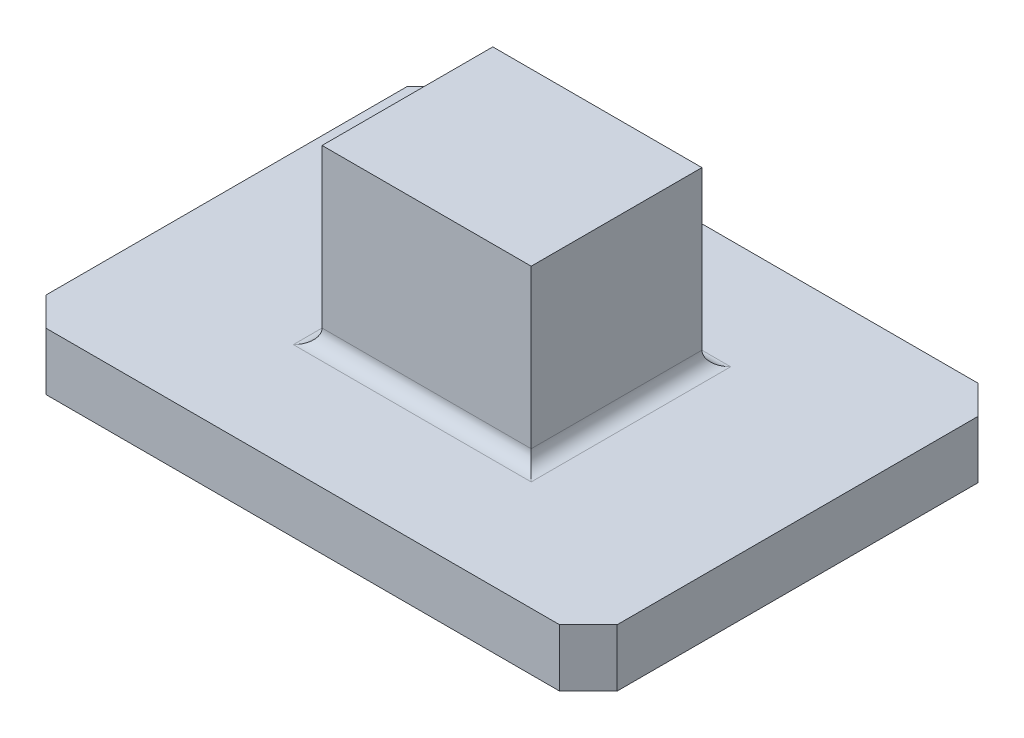
ISO-10303-21;
HEADER;
FILE_DESCRIPTION(('STEP AP214'),'2;1');
FILE_NAME('part.step','',(''),(''),'','','');
FILE_SCHEMA(('AUTOMOTIVE_DESIGN { 1 0 10303 214 1 1 1 1 }'));
ENDSEC;
DATA;
#1=APPLICATION_CONTEXT('core data for automotive mechanical design processes');
#2=APPLICATION_PROTOCOL_DEFINITION('international standard','automotive_design',2000,#1);
#3=PRODUCT_CONTEXT('',#1,'mechanical');
#4=PRODUCT('Part','Part','',(#3));
#5=PRODUCT_RELATED_PRODUCT_CATEGORY('part','',(#4));
#6=PRODUCT_DEFINITION_FORMATION('','',#4);
#7=PRODUCT_DEFINITION_CONTEXT('part definition',#1,'design');
#8=PRODUCT_DEFINITION('design','',#6,#7);
#9=PRODUCT_DEFINITION_SHAPE('','',#8);
#10=(LENGTH_UNIT() NAMED_UNIT(*) SI_UNIT(.MILLI.,.METRE.));
#11=(NAMED_UNIT(*) PLANE_ANGLE_UNIT() SI_UNIT($,.RADIAN.));
#12=(NAMED_UNIT(*) SI_UNIT($,.STERADIAN.) SOLID_ANGLE_UNIT());
#13=UNCERTAINTY_MEASURE_WITH_UNIT(LENGTH_MEASURE(1.E-05),#10,'distance_accuracy_value','');
#14=(GEOMETRIC_REPRESENTATION_CONTEXT(3) GLOBAL_UNCERTAINTY_ASSIGNED_CONTEXT((#13)) GLOBAL_UNIT_ASSIGNED_CONTEXT((#10,
#11,#12)) REPRESENTATION_CONTEXT('',''));
#15=CARTESIAN_POINT('',(0.,0.,0.));
#16=DIRECTION('',(0.,0.,1.));
#17=DIRECTION('',(1.,0.,0.));
#18=AXIS2_PLACEMENT_3D('',#15,#16,#17);
#19=CARTESIAN_POINT('',(0.,20.,0.));
#20=DIRECTION('',(0.,-1.,0.));
#21=DIRECTION('',(0.,0.,-1.));
#22=AXIS2_PLACEMENT_3D('',#19,#20,#21);
#23=PLANE('',#22);
#24=DIRECTION('',(0.,0.,1.));
#25=VECTOR('',#24,1.);
#26=CARTESIAN_POINT('',(-41.3701376891186,20.,-29.6961292121978));
#27=LINE('',#26,#25);
#28=CARTESIAN_POINT('',(-41.3701376891186,20.,34.6961292121978));
#29=VERTEX_POINT('',#28);
#30=CARTESIAN_POINT('',(-41.3701376891186,20.,-34.6961292121978));
#31=VERTEX_POINT('',#30);
#32=EDGE_CURVE('E217',#29,#31,#27,.F.);
#33=ORIENTED_EDGE('',*,*,#32,.T.);
#34=DIRECTION('',(-1.,0.,0.));
#35=VECTOR('',#34,1.);
#36=CARTESIAN_POINT('',(36.3701376891186,20.,-34.6961292121978));
#37=LINE('',#36,#35);
#38=CARTESIAN_POINT('',(41.3701376891186,20.,-34.6961292121978));
#39=VERTEX_POINT('',#38);
#40=EDGE_CURVE('E220',#31,#39,#37,.F.);
#41=ORIENTED_EDGE('',*,*,#40,.T.);
#42=DIRECTION('',(0.,0.,-1.));
#43=VECTOR('',#42,1.);
#44=CARTESIAN_POINT('',(41.3701376891186,20.,29.6961292121978));
#45=LINE('',#44,#43);
#46=CARTESIAN_POINT('',(41.3701376891186,20.,34.6961292121978));
#47=VERTEX_POINT('',#46);
#48=EDGE_CURVE('E214',#39,#47,#45,.F.);
#49=ORIENTED_EDGE('',*,*,#48,.T.);
#50=DIRECTION('',(1.,0.,0.));
#51=VECTOR('',#50,1.);
#52=CARTESIAN_POINT('',(-36.3701376891186,20.,34.6961292121978));
#53=LINE('',#52,#51);
#54=EDGE_CURVE('E211',#47,#29,#53,.F.);
#55=ORIENTED_EDGE('',*,*,#54,.T.);
#56=EDGE_LOOP('',(#33,#41,#49,#55));
#57=FACE_BOUND('',#56,.T.);
#58=DIRECTION('',(-1.,0.,0.));
#59=VECTOR('',#58,1.);
#60=CARTESIAN_POINT('',(-99.3307247926078,20.,-72.7705527284975));
#61=LINE('',#60,#59);
#62=CARTESIAN_POINT('',(89.3307247926078,20.,-72.7705527284975));
#63=VERTEX_POINT('',#62);
#64=CARTESIAN_POINT('',(-89.3307247926078,20.,-72.7705527284975));
#65=VERTEX_POINT('',#64);
#66=EDGE_CURVE('E188',#63,#65,#61,.T.);
#67=ORIENTED_EDGE('',*,*,#66,.T.);
#68=DIRECTION('',(0.707106781186549,0.,-0.707106781186547));
#69=VECTOR('',#68,1.);
#70=CARTESIAN_POINT('',(-99.3307247926078,20.,-62.7705527284975));
#71=LINE('',#70,#69);
#72=CARTESIAN_POINT('',(-99.3307247926078,20.,-62.7705527284975));
#73=VERTEX_POINT('',#72);
#74=EDGE_CURVE('E279',#65,#73,#71,.F.);
#75=ORIENTED_EDGE('',*,*,#74,.T.);
#76=DIRECTION('',(0.,0.,1.));
#77=VECTOR('',#76,1.);
#78=CARTESIAN_POINT('',(-99.3307247926078,20.,72.7705527284975));
#79=LINE('',#78,#77);
#80=CARTESIAN_POINT('',(-99.3307247926078,20.,62.7705527284975));
#81=VERTEX_POINT('',#80);
#82=EDGE_CURVE('E193',#73,#81,#79,.T.);
#83=ORIENTED_EDGE('',*,*,#82,.T.);
#84=DIRECTION('',(-0.707106781186547,0.,-0.707106781186549));
#85=VECTOR('',#84,1.);
#86=CARTESIAN_POINT('',(-89.3307247926078,20.,72.7705527284975));
#87=LINE('',#86,#85);
#88=CARTESIAN_POINT('',(-89.3307247926078,20.,72.7705527284975));
#89=VERTEX_POINT('',#88);
#90=EDGE_CURVE('E63',#81,#89,#87,.F.);
#91=ORIENTED_EDGE('',*,*,#90,.T.);
#92=DIRECTION('',(1.,0.,0.));
#93=VECTOR('',#92,1.);
#94=CARTESIAN_POINT('',(-99.3307247926078,20.,72.7705527284975));
#95=LINE('',#94,#93);
#96=CARTESIAN_POINT('',(89.3307247926078,20.,72.7705527284975));
#97=VERTEX_POINT('',#96);
#98=EDGE_CURVE('E196',#89,#97,#95,.T.);
#99=ORIENTED_EDGE('',*,*,#98,.T.);
#100=DIRECTION('',(-0.707106781186549,0.,0.707106781186547));
#101=VECTOR('',#100,1.);
#102=CARTESIAN_POINT('',(99.3307247926078,20.,62.7705527284975));
#103=LINE('',#102,#101);
#104=CARTESIAN_POINT('',(99.3307247926078,20.,62.7705527284975));
#105=VERTEX_POINT('',#104);
#106=EDGE_CURVE('E271',#97,#105,#103,.F.);
#107=ORIENTED_EDGE('',*,*,#106,.T.);
#108=DIRECTION('',(0.,0.,-1.));
#109=VECTOR('',#108,1.);
#110=CARTESIAN_POINT('',(99.3307247926078,20.,72.7705527284975));
#111=LINE('',#110,#109);
#112=CARTESIAN_POINT('',(99.3307247926078,20.,-62.7705527284975));
#113=VERTEX_POINT('',#112);
#114=EDGE_CURVE('E184',#105,#113,#111,.T.);
#115=ORIENTED_EDGE('',*,*,#114,.T.);
#116=DIRECTION('',(0.707106781186547,0.,0.707106781186549));
#117=VECTOR('',#116,1.);
#118=CARTESIAN_POINT('',(89.3307247926078,20.,-72.7705527284975));
#119=LINE('',#118,#117);
#120=EDGE_CURVE('E276',#113,#63,#119,.F.);
#121=ORIENTED_EDGE('',*,*,#120,.T.);
#122=EDGE_LOOP('',(#67,#75,#83,#91,#99,#107,#115,#121));
#123=FACE_BOUND('',#122,.T.);
#124=ADVANCED_FACE('F40',(#57,#123),#23,.F.);
#125=CARTESIAN_POINT('',(99.3307247926078,20.,72.7705527284975));
#126=DIRECTION('',(-1.,0.,0.));
#127=DIRECTION('',(0.,0.,1.));
#128=AXIS2_PLACEMENT_3D('',#125,#126,#127);
#129=PLANE('',#128);
#130=DIRECTION('',(0.,0.,-1.));
#131=VECTOR('',#130,1.);
#132=CARTESIAN_POINT('',(99.3307247926078,0.,72.7705527284975));
#133=LINE('',#132,#131);
#134=CARTESIAN_POINT('',(99.3307247926078,0.,62.7705527284975));
#135=VERTEX_POINT('',#134);
#136=CARTESIAN_POINT('',(99.3307247926078,0.,-62.7705527284975));
#137=VERTEX_POINT('',#136);
#138=EDGE_CURVE('E173',#135,#137,#133,.T.);
#139=ORIENTED_EDGE('',*,*,#138,.T.);
#140=DIRECTION('',(0.,1.,0.));
#141=VECTOR('',#140,1.);
#142=CARTESIAN_POINT('',(99.3307247926078,20.,-62.7705527284975));
#143=LINE('',#142,#141);
#144=EDGE_CURVE('E286',#137,#113,#143,.T.);
#145=ORIENTED_EDGE('',*,*,#144,.T.);
#146=ORIENTED_EDGE('',*,*,#114,.F.);
#147=DIRECTION('',(0.,-1.,0.));
#148=VECTOR('',#147,1.);
#149=CARTESIAN_POINT('',(99.3307247926078,20.,62.7705527284975));
#150=LINE('',#149,#148);
#151=EDGE_CURVE('E282',#105,#135,#150,.T.);
#152=ORIENTED_EDGE('',*,*,#151,.T.);
#153=EDGE_LOOP('',(#139,#145,#146,#152));
#154=FACE_BOUND('',#153,.T.);
#155=ADVANCED_FACE('F292',(#154),#129,.F.);
#156=CARTESIAN_POINT('',(-99.3307247926078,20.,-72.7705527284975));
#157=DIRECTION('',(0.,0.,1.));
#158=DIRECTION('',(1.,0.,0.));
#159=AXIS2_PLACEMENT_3D('',#156,#157,#158);
#160=PLANE('',#159);
#161=DIRECTION('',(-1.,0.,0.));
#162=VECTOR('',#161,1.);
#163=CARTESIAN_POINT('',(-99.3307247926078,0.,-72.7705527284975));
#164=LINE('',#163,#162);
#165=CARTESIAN_POINT('',(89.3307247926078,0.,-72.7705527284975));
#166=VERTEX_POINT('',#165);
#167=CARTESIAN_POINT('',(-89.3307247926078,0.,-72.7705527284975));
#168=VERTEX_POINT('',#167);
#169=EDGE_CURVE('E178',#166,#168,#164,.T.);
#170=ORIENTED_EDGE('',*,*,#169,.T.);
#171=DIRECTION('',(0.,1.,0.));
#172=VECTOR('',#171,1.);
#173=CARTESIAN_POINT('',(-89.3307247926078,20.,-72.7705527284975));
#174=LINE('',#173,#172);
#175=EDGE_CURVE('E268',#168,#65,#174,.T.);
#176=ORIENTED_EDGE('',*,*,#175,.T.);
#177=ORIENTED_EDGE('',*,*,#66,.F.);
#178=DIRECTION('',(0.,-1.,0.));
#179=VECTOR('',#178,1.);
#180=CARTESIAN_POINT('',(89.3307247926078,20.,-72.7705527284975));
#181=LINE('',#180,#179);
#182=EDGE_CURVE('E264',#63,#166,#181,.T.);
#183=ORIENTED_EDGE('',*,*,#182,.T.);
#184=EDGE_LOOP('',(#170,#176,#177,#183));
#185=FACE_BOUND('',#184,.T.);
#186=ADVANCED_FACE('F303',(#185),#160,.F.);
#187=CARTESIAN_POINT('',(-99.3307247926078,20.,72.7705527284975));
#188=DIRECTION('',(1.,0.,0.));
#189=DIRECTION('',(0.,0.,-1.));
#190=AXIS2_PLACEMENT_3D('',#187,#188,#189);
#191=PLANE('',#190);
#192=ORIENTED_EDGE('',*,*,#82,.F.);
#193=DIRECTION('',(0.,-1.,0.));
#194=VECTOR('',#193,1.);
#195=CARTESIAN_POINT('',(-99.3307247926078,20.,-62.7705527284975));
#196=LINE('',#195,#194);
#197=CARTESIAN_POINT('',(-99.3307247926078,0.,-62.7705527284975));
#198=VERTEX_POINT('',#197);
#199=EDGE_CURVE('E248',#73,#198,#196,.T.);
#200=ORIENTED_EDGE('',*,*,#199,.T.);
#201=DIRECTION('',(0.,0.,1.));
#202=VECTOR('',#201,1.);
#203=CARTESIAN_POINT('',(-99.3307247926078,0.,72.7705527284975));
#204=LINE('',#203,#202);
#205=CARTESIAN_POINT('',(-99.3307247926078,0.,62.7705527284975));
#206=VERTEX_POINT('',#205);
#207=EDGE_CURVE('E203',#198,#206,#204,.T.);
#208=ORIENTED_EDGE('',*,*,#207,.T.);
#209=DIRECTION('',(0.,1.,0.));
#210=VECTOR('',#209,1.);
#211=CARTESIAN_POINT('',(-99.3307247926078,20.,62.7705527284975));
#212=LINE('',#211,#210);
#213=EDGE_CURVE('E232',#206,#81,#212,.T.);
#214=ORIENTED_EDGE('',*,*,#213,.T.);
#215=EDGE_LOOP('',(#192,#200,#208,#214));
#216=FACE_BOUND('',#215,.T.);
#217=ADVANCED_FACE('F314',(#216),#191,.F.);
#218=CARTESIAN_POINT('',(-99.3307247926078,20.,72.7705527284975));
#219=DIRECTION('',(0.,0.,-1.));
#220=DIRECTION('',(-1.,0.,0.));
#221=AXIS2_PLACEMENT_3D('',#218,#219,#220);
#222=PLANE('',#221);
#223=ORIENTED_EDGE('',*,*,#98,.F.);
#224=DIRECTION('',(0.,-1.,0.));
#225=VECTOR('',#224,1.);
#226=CARTESIAN_POINT('',(-89.3307247926078,20.,72.7705527284975));
#227=LINE('',#226,#225);
#228=CARTESIAN_POINT('',(-89.3307247926078,0.,72.7705527284975));
#229=VERTEX_POINT('',#228);
#230=EDGE_CURVE('E11',#89,#229,#227,.T.);
#231=ORIENTED_EDGE('',*,*,#230,.T.);
#232=DIRECTION('',(1.,0.,0.));
#233=VECTOR('',#232,1.);
#234=CARTESIAN_POINT('',(-99.3307247926078,0.,72.7705527284975));
#235=LINE('',#234,#233);
#236=CARTESIAN_POINT('',(89.3307247926078,0.,72.7705527284975));
#237=VERTEX_POINT('',#236);
#238=EDGE_CURVE('E189',#229,#237,#235,.T.);
#239=ORIENTED_EDGE('',*,*,#238,.T.);
#240=DIRECTION('',(0.,1.,0.));
#241=VECTOR('',#240,1.);
#242=CARTESIAN_POINT('',(89.3307247926078,20.,72.7705527284975));
#243=LINE('',#242,#241);
#244=EDGE_CURVE('E50',#237,#97,#243,.T.);
#245=ORIENTED_EDGE('',*,*,#244,.T.);
#246=EDGE_LOOP('',(#223,#231,#239,#245));
#247=FACE_BOUND('',#246,.T.);
#248=ADVANCED_FACE('F320',(#247),#222,.F.);
#249=CARTESIAN_POINT('',(0.,0.,0.));
#250=DIRECTION('',(0.,-1.,0.));
#251=DIRECTION('',(0.,0.,-1.));
#252=AXIS2_PLACEMENT_3D('',#249,#250,#251);
#253=PLANE('',#252);
#254=ORIENTED_EDGE('',*,*,#207,.F.);
#255=DIRECTION('',(-0.707106781186549,0.,0.707106781186547));
#256=VECTOR('',#255,1.);
#257=CARTESIAN_POINT('',(-81.0506387605525,0.,-81.0506387605527));
#258=LINE('',#257,#256);
#259=EDGE_CURVE('E261',#198,#168,#258,.F.);
#260=ORIENTED_EDGE('',*,*,#259,.T.);
#261=ORIENTED_EDGE('',*,*,#169,.F.);
#262=DIRECTION('',(-0.707106781186547,0.,-0.707106781186549));
#263=VECTOR('',#262,1.);
#264=CARTESIAN_POINT('',(81.0506387605528,0.,-81.0506387605525));
#265=LINE('',#264,#263);
#266=EDGE_CURVE('E258',#166,#137,#265,.F.);
#267=ORIENTED_EDGE('',*,*,#266,.T.);
#268=ORIENTED_EDGE('',*,*,#138,.F.);
#269=DIRECTION('',(0.707106781186549,0.,-0.707106781186547));
#270=VECTOR('',#269,1.);
#271=CARTESIAN_POINT('',(81.0506387605525,0.,81.0506387605527));
#272=LINE('',#271,#270);
#273=EDGE_CURVE('E252',#135,#237,#272,.F.);
#274=ORIENTED_EDGE('',*,*,#273,.T.);
#275=ORIENTED_EDGE('',*,*,#238,.F.);
#276=DIRECTION('',(0.707106781186547,0.,0.707106781186549));
#277=VECTOR('',#276,1.);
#278=CARTESIAN_POINT('',(-81.0506387605528,0.,81.0506387605525));
#279=LINE('',#278,#277);
#280=EDGE_CURVE('E255',#229,#206,#279,.F.);
#281=ORIENTED_EDGE('',*,*,#280,.T.);
#282=EDGE_LOOP('',(#254,#260,#261,#267,#268,#274,#275,#281));
#283=FACE_BOUND('',#282,.T.);
#284=ADVANCED_FACE('F307',(#283),#253,.T.);
#285=CARTESIAN_POINT('',(36.3701376891186,80.,29.6961292121978));
#286=DIRECTION('',(-1.,0.,0.));
#287=DIRECTION('',(0.,0.,1.));
#288=AXIS2_PLACEMENT_3D('',#285,#286,#287);
#289=PLANE('',#288);
#290=DIRECTION('',(0.,-1.,0.));
#291=VECTOR('',#290,1.);
#292=CARTESIAN_POINT('',(36.3701376891186,80.,29.6961292121978));
#293=LINE('',#292,#291);
#294=CARTESIAN_POINT('',(36.3701376891186,80.,29.6961292121978));
#295=VERTEX_POINT('',#294);
#296=CARTESIAN_POINT('',(36.3701376891186,25.,29.6961292121978));
#297=VERTEX_POINT('',#296);
#298=EDGE_CURVE('E497',#295,#297,#293,.T.);
#299=ORIENTED_EDGE('',*,*,#298,.T.);
#300=DIRECTION('',(0.,0.,-1.));
#301=VECTOR('',#300,1.);
#302=CARTESIAN_POINT('',(36.3701376891186,25.,-29.6961292121978));
#303=LINE('',#302,#301);
#304=CARTESIAN_POINT('',(36.3701376891186,25.,-29.6961292121978));
#305=VERTEX_POINT('',#304);
#306=EDGE_CURVE('E171',#297,#305,#303,.T.);
#307=ORIENTED_EDGE('',*,*,#306,.T.);
#308=DIRECTION('',(0.,-1.,0.));
#309=VECTOR('',#308,1.);
#310=CARTESIAN_POINT('',(36.3701376891186,80.,-29.6961292121978));
#311=LINE('',#310,#309);
#312=CARTESIAN_POINT('',(36.3701376891186,80.,-29.6961292121978));
#313=VERTEX_POINT('',#312);
#314=EDGE_CURVE('E149',#313,#305,#311,.T.);
#315=ORIENTED_EDGE('',*,*,#314,.F.);
#316=DIRECTION('',(0.,0.,-1.));
#317=VECTOR('',#316,1.);
#318=CARTESIAN_POINT('',(36.3701376891186,80.,29.6961292121978));
#319=LINE('',#318,#317);
#320=EDGE_CURVE('E157',#295,#313,#319,.T.);
#321=ORIENTED_EDGE('',*,*,#320,.F.);
#322=EDGE_LOOP('',(#299,#307,#315,#321));
#323=FACE_BOUND('',#322,.T.);
#324=ADVANCED_FACE('F169',(#323),#289,.F.);
#325=CARTESIAN_POINT('',(-36.3701376891186,80.,-29.6961292121978));
#326=DIRECTION('',(0.,0.,1.));
#327=DIRECTION('',(1.,0.,0.));
#328=AXIS2_PLACEMENT_3D('',#325,#326,#327);
#329=PLANE('',#328);
#330=ORIENTED_EDGE('',*,*,#314,.T.);
#331=DIRECTION('',(-1.,0.,0.));
#332=VECTOR('',#331,1.);
#333=CARTESIAN_POINT('',(-36.3701376891186,25.,-29.6961292121978));
#334=LINE('',#333,#332);
#335=CARTESIAN_POINT('',(-36.3701376891186,25.,-29.6961292121978));
#336=VERTEX_POINT('',#335);
#337=EDGE_CURVE('E198',#305,#336,#334,.T.);
#338=ORIENTED_EDGE('',*,*,#337,.T.);
#339=DIRECTION('',(0.,-1.,0.));
#340=VECTOR('',#339,1.);
#341=CARTESIAN_POINT('',(-36.3701376891186,80.,-29.6961292121978));
#342=LINE('',#341,#340);
#343=CARTESIAN_POINT('',(-36.3701376891186,80.,-29.6961292121978));
#344=VERTEX_POINT('',#343);
#345=EDGE_CURVE('E152',#344,#336,#342,.T.);
#346=ORIENTED_EDGE('',*,*,#345,.F.);
#347=DIRECTION('',(-1.,0.,0.));
#348=VECTOR('',#347,1.);
#349=CARTESIAN_POINT('',(-36.3701376891186,80.,-29.6961292121978));
#350=LINE('',#349,#348);
#351=EDGE_CURVE('E144',#313,#344,#350,.T.);
#352=ORIENTED_EDGE('',*,*,#351,.F.);
#353=EDGE_LOOP('',(#330,#338,#346,#352));
#354=FACE_BOUND('',#353,.T.);
#355=ADVANCED_FACE('F146',(#354),#329,.F.);
#356=CARTESIAN_POINT('',(-36.3701376891186,80.,29.6961292121978));
#357=DIRECTION('',(1.,0.,0.));
#358=DIRECTION('',(0.,0.,-1.));
#359=AXIS2_PLACEMENT_3D('',#356,#357,#358);
#360=PLANE('',#359);
#361=ORIENTED_EDGE('',*,*,#345,.T.);
#362=DIRECTION('',(0.,0.,1.));
#363=VECTOR('',#362,1.);
#364=CARTESIAN_POINT('',(-36.3701376891186,25.,29.6961292121978));
#365=LINE('',#364,#363);
#366=CARTESIAN_POINT('',(-36.3701376891186,25.,29.6961292121978));
#367=VERTEX_POINT('',#366);
#368=EDGE_CURVE('E224',#336,#367,#365,.T.);
#369=ORIENTED_EDGE('',*,*,#368,.T.);
#370=DIRECTION('',(0.,-1.,0.));
#371=VECTOR('',#370,1.);
#372=CARTESIAN_POINT('',(-36.3701376891186,80.,29.6961292121978));
#373=LINE('',#372,#371);
#374=CARTESIAN_POINT('',(-36.3701376891186,80.,29.6961292121978));
#375=VERTEX_POINT('',#374);
#376=EDGE_CURVE('E180',#375,#367,#373,.T.);
#377=ORIENTED_EDGE('',*,*,#376,.F.);
#378=DIRECTION('',(0.,0.,1.));
#379=VECTOR('',#378,1.);
#380=CARTESIAN_POINT('',(-36.3701376891186,80.,29.6961292121978));
#381=LINE('',#380,#379);
#382=EDGE_CURVE('E156',#344,#375,#381,.T.);
#383=ORIENTED_EDGE('',*,*,#382,.F.);
#384=EDGE_LOOP('',(#361,#369,#377,#383));
#385=FACE_BOUND('',#384,.T.);
#386=ADVANCED_FACE('F431',(#385),#360,.F.);
#387=CARTESIAN_POINT('',(-36.3701376891186,80.,29.6961292121978));
#388=DIRECTION('',(0.,0.,-1.));
#389=DIRECTION('',(-1.,0.,0.));
#390=AXIS2_PLACEMENT_3D('',#387,#388,#389);
#391=PLANE('',#390);
#392=ORIENTED_EDGE('',*,*,#376,.T.);
#393=DIRECTION('',(1.,0.,0.));
#394=VECTOR('',#393,1.);
#395=CARTESIAN_POINT('',(36.3701376891186,25.,29.6961292121978));
#396=LINE('',#395,#394);
#397=EDGE_CURVE('E229',#367,#297,#396,.T.);
#398=ORIENTED_EDGE('',*,*,#397,.T.);
#399=ORIENTED_EDGE('',*,*,#298,.F.);
#400=DIRECTION('',(1.,0.,0.));
#401=VECTOR('',#400,1.);
#402=CARTESIAN_POINT('',(-36.3701376891186,80.,29.6961292121978));
#403=LINE('',#402,#401);
#404=EDGE_CURVE('E162',#375,#295,#403,.T.);
#405=ORIENTED_EDGE('',*,*,#404,.F.);
#406=EDGE_LOOP('',(#392,#398,#399,#405));
#407=FACE_BOUND('',#406,.T.);
#408=ADVANCED_FACE('F423',(#407),#391,.F.);
#409=CARTESIAN_POINT('',(0.,80.,0.));
#410=DIRECTION('',(0.,-1.,0.));
#411=DIRECTION('',(0.,0.,-1.));
#412=AXIS2_PLACEMENT_3D('',#409,#410,#411);
#413=PLANE('',#412);
#414=ORIENTED_EDGE('',*,*,#320,.T.);
#415=ORIENTED_EDGE('',*,*,#351,.T.);
#416=ORIENTED_EDGE('',*,*,#382,.T.);
#417=ORIENTED_EDGE('',*,*,#404,.T.);
#418=EDGE_LOOP('',(#414,#415,#416,#417));
#419=FACE_BOUND('',#418,.T.);
#420=ADVANCED_FACE('F160',(#419),#413,.F.);
#421=CARTESIAN_POINT('',(-36.3701376891186,25.,34.6961292121978));
#422=DIRECTION('',(-1.,0.,0.));
#423=DIRECTION('',(0.,0.,1.));
#424=AXIS2_PLACEMENT_3D('',#421,#422,#423);
#425=CYLINDRICAL_SURFACE('',#424,5.);
#426=CARTESIAN_POINT('',(-41.3701376891186,25.,34.6961292121978));
#427=DIRECTION('',(-0.707106781186547,0.,-0.707106781186547));
#428=DIRECTION('',(-0.707106781186547,0.,0.707106781186547));
#429=AXIS2_PLACEMENT_3D('',#426,#427,#428);
#430=ELLIPSE('',#429,7.07106781186547,5.);
#431=EDGE_CURVE('E239',#29,#367,#430,.F.);
#432=ORIENTED_EDGE('',*,*,#431,.F.);
#433=ORIENTED_EDGE('',*,*,#54,.F.);
#434=CARTESIAN_POINT('',(41.3701376891186,25.,34.6961292121978));
#435=DIRECTION('',(-0.707106781186547,0.,0.707106781186547));
#436=DIRECTION('',(-0.707106781186547,0.,-0.707106781186547));
#437=AXIS2_PLACEMENT_3D('',#434,#435,#436);
#438=ELLIPSE('',#437,7.07106781186547,5.);
#439=EDGE_CURVE('E167',#297,#47,#438,.T.);
#440=ORIENTED_EDGE('',*,*,#439,.F.);
#441=ORIENTED_EDGE('',*,*,#397,.F.);
#442=EDGE_LOOP('',(#432,#433,#440,#441));
#443=FACE_BOUND('',#442,.T.);
#444=ADVANCED_FACE('F356',(#443),#425,.F.);
#445=CARTESIAN_POINT('',(41.3701376891186,25.,29.6961292121978));
#446=DIRECTION('',(0.,0.,1.));
#447=DIRECTION('',(1.,0.,0.));
#448=AXIS2_PLACEMENT_3D('',#445,#446,#447);
#449=CYLINDRICAL_SURFACE('',#448,5.);
#450=ORIENTED_EDGE('',*,*,#439,.T.);
#451=ORIENTED_EDGE('',*,*,#48,.F.);
#452=CARTESIAN_POINT('',(41.3701376891186,25.,-34.6961292121978));
#453=DIRECTION('',(0.707106781186547,0.,0.707106781186547));
#454=DIRECTION('',(-0.707106781186547,0.,0.707106781186547));
#455=AXIS2_PLACEMENT_3D('',#452,#453,#454);
#456=ELLIPSE('',#455,7.07106781186547,5.);
#457=EDGE_CURVE('E236',#305,#39,#456,.T.);
#458=ORIENTED_EDGE('',*,*,#457,.F.);
#459=ORIENTED_EDGE('',*,*,#306,.F.);
#460=EDGE_LOOP('',(#450,#451,#458,#459));
#461=FACE_BOUND('',#460,.T.);
#462=ADVANCED_FACE('F352',(#461),#449,.F.);
#463=CARTESIAN_POINT('',(-41.3701376891186,25.,29.6961292121978));
#464=DIRECTION('',(0.,0.,-1.));
#465=DIRECTION('',(-1.,0.,0.));
#466=AXIS2_PLACEMENT_3D('',#463,#464,#465);
#467=CYLINDRICAL_SURFACE('',#466,5.);
#468=ORIENTED_EDGE('',*,*,#431,.T.);
#469=ORIENTED_EDGE('',*,*,#368,.F.);
#470=CARTESIAN_POINT('',(-41.3701376891186,25.,-34.6961292121978));
#471=DIRECTION('',(0.707106781186547,0.,-0.707106781186547));
#472=DIRECTION('',(-0.707106781186547,0.,-0.707106781186547));
#473=AXIS2_PLACEMENT_3D('',#470,#471,#472);
#474=ELLIPSE('',#473,7.07106781186547,5.);
#475=EDGE_CURVE('E233',#31,#336,#474,.F.);
#476=ORIENTED_EDGE('',*,*,#475,.F.);
#477=ORIENTED_EDGE('',*,*,#32,.F.);
#478=EDGE_LOOP('',(#468,#469,#476,#477));
#479=FACE_BOUND('',#478,.T.);
#480=ADVANCED_FACE('F348',(#479),#467,.F.);
#481=CARTESIAN_POINT('',(-36.3701376891186,25.,-34.6961292121978));
#482=DIRECTION('',(1.,0.,0.));
#483=DIRECTION('',(0.,0.,-1.));
#484=AXIS2_PLACEMENT_3D('',#481,#482,#483);
#485=CYLINDRICAL_SURFACE('',#484,5.);
#486=ORIENTED_EDGE('',*,*,#457,.T.);
#487=ORIENTED_EDGE('',*,*,#40,.F.);
#488=ORIENTED_EDGE('',*,*,#475,.T.);
#489=ORIENTED_EDGE('',*,*,#337,.F.);
#490=EDGE_LOOP('',(#486,#487,#488,#489));
#491=FACE_BOUND('',#490,.T.);
#492=ADVANCED_FACE('F345',(#491),#485,.F.);
#493=CARTESIAN_POINT('',(-99.3307247926078,20.,-62.7705527284975));
#494=DIRECTION('',(0.707106781186546,0.,0.707106781186548));
#495=DIRECTION('',(0.,-1.,0.));
#496=AXIS2_PLACEMENT_3D('',#493,#494,#495);
#497=PLANE('',#496);
#498=ORIENTED_EDGE('',*,*,#74,.F.);
#499=ORIENTED_EDGE('',*,*,#175,.F.);
#500=ORIENTED_EDGE('',*,*,#259,.F.);
#501=ORIENTED_EDGE('',*,*,#199,.F.);
#502=EDGE_LOOP('',(#498,#499,#500,#501));
#503=FACE_BOUND('',#502,.T.);
#504=ADVANCED_FACE('F311',(#503),#497,.F.);
#505=CARTESIAN_POINT('',(89.3307247926078,20.,-72.7705527284975));
#506=DIRECTION('',(-0.707106781186548,0.,0.707106781186546));
#507=DIRECTION('',(0.,-1.,0.));
#508=AXIS2_PLACEMENT_3D('',#505,#506,#507);
#509=PLANE('',#508);
#510=ORIENTED_EDGE('',*,*,#120,.F.);
#511=ORIENTED_EDGE('',*,*,#144,.F.);
#512=ORIENTED_EDGE('',*,*,#266,.F.);
#513=ORIENTED_EDGE('',*,*,#182,.F.);
#514=EDGE_LOOP('',(#510,#511,#512,#513));
#515=FACE_BOUND('',#514,.T.);
#516=ADVANCED_FACE('F300',(#515),#509,.F.);
#517=CARTESIAN_POINT('',(-89.3307247926078,20.,72.7705527284975));
#518=DIRECTION('',(0.707106781186548,0.,-0.707106781186546));
#519=DIRECTION('',(0.,-1.,0.));
#520=AXIS2_PLACEMENT_3D('',#517,#518,#519);
#521=PLANE('',#520);
#522=ORIENTED_EDGE('',*,*,#90,.F.);
#523=ORIENTED_EDGE('',*,*,#213,.F.);
#524=ORIENTED_EDGE('',*,*,#280,.F.);
#525=ORIENTED_EDGE('',*,*,#230,.F.);
#526=EDGE_LOOP('',(#522,#523,#524,#525));
#527=FACE_BOUND('',#526,.T.);
#528=ADVANCED_FACE('F318',(#527),#521,.F.);
#529=CARTESIAN_POINT('',(99.3307247926078,20.,62.7705527284975));
#530=DIRECTION('',(-0.707106781186546,0.,-0.707106781186548));
#531=DIRECTION('',(0.,-1.,0.));
#532=AXIS2_PLACEMENT_3D('',#529,#530,#531);
#533=PLANE('',#532);
#534=ORIENTED_EDGE('',*,*,#106,.F.);
#535=ORIENTED_EDGE('',*,*,#244,.F.);
#536=ORIENTED_EDGE('',*,*,#273,.F.);
#537=ORIENTED_EDGE('',*,*,#151,.F.);
#538=EDGE_LOOP('',(#534,#535,#536,#537));
#539=FACE_BOUND('',#538,.T.);
#540=ADVANCED_FACE('F43',(#539),#533,.F.);
#541=CLOSED_SHELL('',(#124,#155,#186,#217,#248,#284,#324,#355,#386,#408,#420,#444,#462,#480,
#492,#504,#516,#528,#540));
#542=MANIFOLD_SOLID_BREP('B2',#541);
#543=ADVANCED_BREP_SHAPE_REPRESENTATION('',(#18,#542),#14);
#544=SHAPE_DEFINITION_REPRESENTATION(#9,#543);
ENDSEC;
END-ISO-10303-21;
